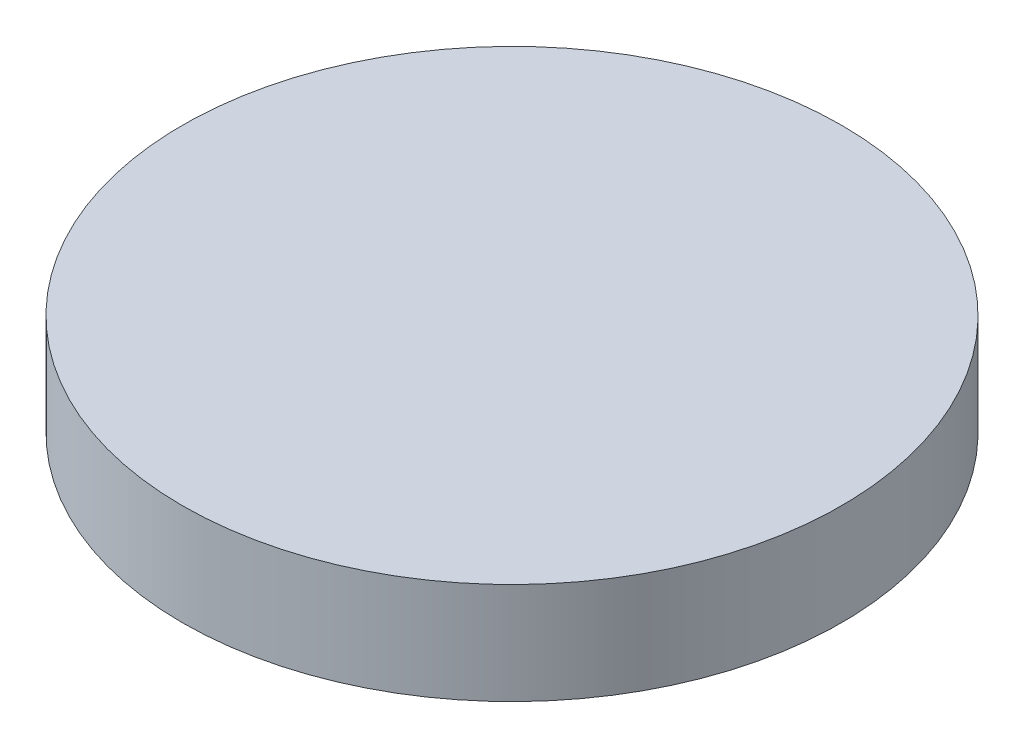
ISO-10303-21;
HEADER;
FILE_DESCRIPTION(('STEP AP214'),'2;1');
FILE_NAME('part.step','',(''),(''),'','','');
FILE_SCHEMA(('AUTOMOTIVE_DESIGN { 1 0 10303 214 1 1 1 1 }'));
ENDSEC;
DATA;
#1=APPLICATION_CONTEXT('core data for automotive mechanical design processes');
#2=APPLICATION_PROTOCOL_DEFINITION('international standard','automotive_design',2000,#1);
#3=PRODUCT_CONTEXT('',#1,'mechanical');
#4=PRODUCT('Part','Part','',(#3));
#5=PRODUCT_RELATED_PRODUCT_CATEGORY('part','',(#4));
#6=PRODUCT_DEFINITION_FORMATION('','',#4);
#7=PRODUCT_DEFINITION_CONTEXT('part definition',#1,'design');
#8=PRODUCT_DEFINITION('design','',#6,#7);
#9=PRODUCT_DEFINITION_SHAPE('','',#8);
#10=(LENGTH_UNIT() NAMED_UNIT(*) SI_UNIT(.MILLI.,.METRE.));
#11=(NAMED_UNIT(*) PLANE_ANGLE_UNIT() SI_UNIT($,.RADIAN.));
#12=(NAMED_UNIT(*) SI_UNIT($,.STERADIAN.) SOLID_ANGLE_UNIT());
#13=UNCERTAINTY_MEASURE_WITH_UNIT(LENGTH_MEASURE(1.E-05),#10,'distance_accuracy_value','');
#14=(GEOMETRIC_REPRESENTATION_CONTEXT(3) GLOBAL_UNCERTAINTY_ASSIGNED_CONTEXT((#13)) GLOBAL_UNIT_ASSIGNED_CONTEXT((#10,
#11,#12)) REPRESENTATION_CONTEXT('',''));
#15=CARTESIAN_POINT('',(0.,0.,0.));
#16=DIRECTION('',(0.,0.,1.));
#17=DIRECTION('',(1.,0.,0.));
#18=AXIS2_PLACEMENT_3D('',#15,#16,#17);
#19=CARTESIAN_POINT('',(0.,6.35,0.));
#20=DIRECTION('',(0.,-1.,0.));
#21=DIRECTION('',(0.,0.,-1.));
#22=AXIS2_PLACEMENT_3D('',#19,#20,#21);
#23=CYLINDRICAL_SURFACE('',#22,20.64);
#24=CARTESIAN_POINT('',(0.,6.35,0.));
#25=DIRECTION('',(0.,1.,0.));
#26=DIRECTION('',(0.,0.,1.));
#27=AXIS2_PLACEMENT_3D('',#24,#25,#26);
#28=CIRCLE('',#27,20.64);
#29=CARTESIAN_POINT('',(0.,6.35,20.64));
#30=VERTEX_POINT('',#29);
#31=EDGE_CURVE('E10',#30,#30,#28,.T.);
#32=ORIENTED_EDGE('',*,*,#31,.F.);
#33=EDGE_LOOP('',(#32));
#34=FACE_BOUND('',#33,.T.);
#35=CARTESIAN_POINT('',(0.,0.,0.));
#36=DIRECTION('',(0.,1.,0.));
#37=DIRECTION('',(0.,0.,1.));
#38=AXIS2_PLACEMENT_3D('',#35,#36,#37);
#39=CIRCLE('',#38,20.64);
#40=CARTESIAN_POINT('',(0.,0.,20.64));
#41=VERTEX_POINT('',#40);
#42=EDGE_CURVE('E40',#41,#41,#39,.T.);
#43=ORIENTED_EDGE('',*,*,#42,.T.);
#44=EDGE_LOOP('',(#43));
#45=FACE_BOUND('',#44,.T.);
#46=ADVANCED_FACE('F37',(#34,#45),#23,.T.);
#47=CARTESIAN_POINT('',(0.,6.35,0.));
#48=DIRECTION('',(0.,1.,0.));
#49=DIRECTION('',(0.,0.,1.));
#50=AXIS2_PLACEMENT_3D('',#47,#48,#49);
#51=PLANE('',#50);
#52=ORIENTED_EDGE('',*,*,#31,.T.);
#53=EDGE_LOOP('',(#52));
#54=FACE_BOUND('',#53,.T.);
#55=ADVANCED_FACE('F54',(#54),#51,.T.);
#56=CARTESIAN_POINT('',(0.,0.,0.));
#57=DIRECTION('',(0.,1.,0.));
#58=DIRECTION('',(0.,0.,1.));
#59=AXIS2_PLACEMENT_3D('',#56,#57,#58);
#60=PLANE('',#59);
#61=ORIENTED_EDGE('',*,*,#42,.F.);
#62=EDGE_LOOP('',(#61));
#63=FACE_BOUND('',#62,.T.);
#64=ADVANCED_FACE('F52',(#63),#60,.F.);
#65=CLOSED_SHELL('',(#46,#55,#64));
#66=MANIFOLD_SOLID_BREP('B2',#65);
#67=ADVANCED_BREP_SHAPE_REPRESENTATION('',(#18,#66),#14);
#68=SHAPE_DEFINITION_REPRESENTATION(#9,#67);
ENDSEC;
END-ISO-10303-21;
